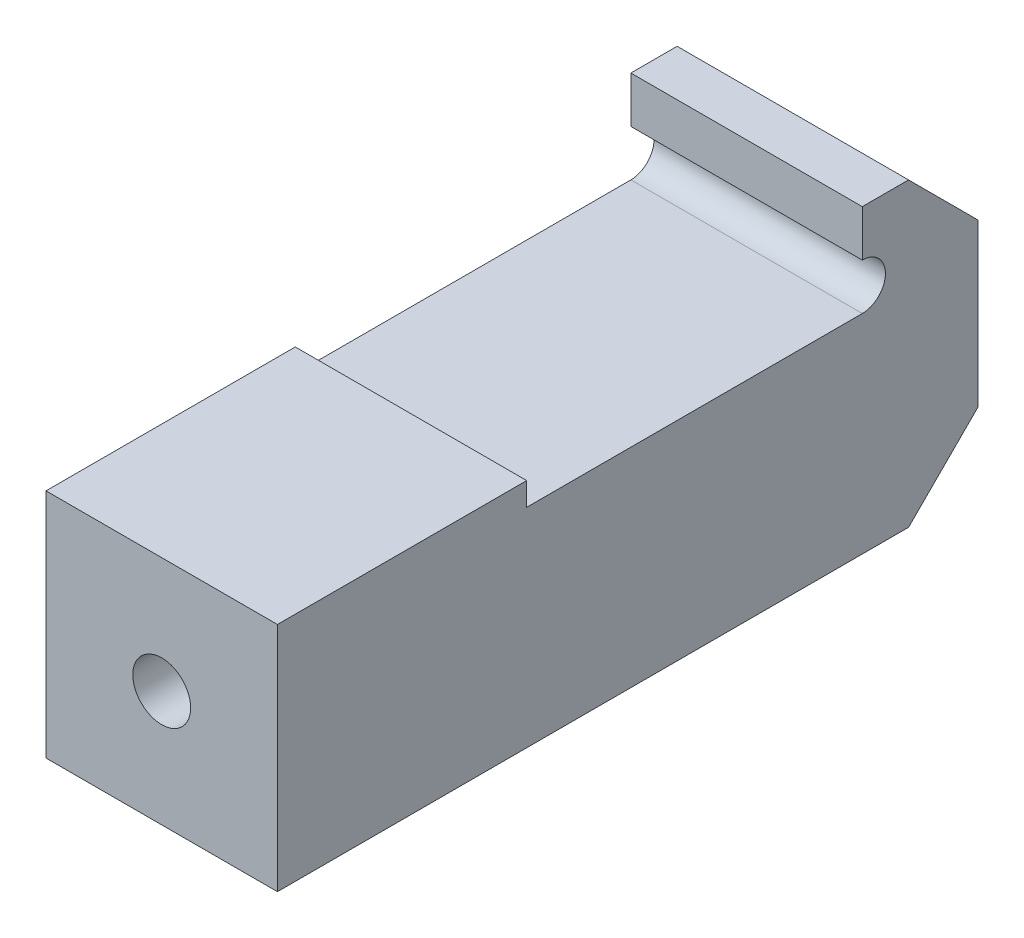
ISO-10303-21;
HEADER;
FILE_DESCRIPTION(('STEP AP214'),'2;1');
FILE_NAME('part.step','',(''),(''),'','','');
FILE_SCHEMA(('AUTOMOTIVE_DESIGN { 1 0 10303 214 1 1 1 1 }'));
ENDSEC;
DATA;
#1=APPLICATION_CONTEXT('core data for automotive mechanical design processes');
#2=APPLICATION_PROTOCOL_DEFINITION('international standard','automotive_design',2000,#1);
#3=PRODUCT_CONTEXT('',#1,'mechanical');
#4=PRODUCT('Part','Part','',(#3));
#5=PRODUCT_RELATED_PRODUCT_CATEGORY('part','',(#4));
#6=PRODUCT_DEFINITION_FORMATION('','',#4);
#7=PRODUCT_DEFINITION_CONTEXT('part definition',#1,'design');
#8=PRODUCT_DEFINITION('design','',#6,#7);
#9=PRODUCT_DEFINITION_SHAPE('','',#8);
#10=(LENGTH_UNIT() NAMED_UNIT(*) SI_UNIT(.MILLI.,.METRE.));
#11=(NAMED_UNIT(*) PLANE_ANGLE_UNIT() SI_UNIT($,.RADIAN.));
#12=(NAMED_UNIT(*) SI_UNIT($,.STERADIAN.) SOLID_ANGLE_UNIT());
#13=UNCERTAINTY_MEASURE_WITH_UNIT(LENGTH_MEASURE(1.E-05),#10,'distance_accuracy_value','');
#14=(GEOMETRIC_REPRESENTATION_CONTEXT(3) GLOBAL_UNCERTAINTY_ASSIGNED_CONTEXT((#13)) GLOBAL_UNIT_ASSIGNED_CONTEXT((#10,
#11,#12)) REPRESENTATION_CONTEXT('',''));
#15=CARTESIAN_POINT('',(0.,0.,0.));
#16=DIRECTION('',(0.,0.,1.));
#17=DIRECTION('',(1.,0.,0.));
#18=AXIS2_PLACEMENT_3D('',#15,#16,#17);
#19=CARTESIAN_POINT('',(-10.,0.,0.));
#20=DIRECTION('',(1.,0.,0.));
#21=DIRECTION('',(0.,0.,-1.));
#22=AXIS2_PLACEMENT_3D('',#19,#20,#21);
#23=CYLINDRICAL_SURFACE('',#22,1.);
#24=CARTESIAN_POINT('',(0.,0.,0.));
#25=DIRECTION('',(-1.,0.,0.));
#26=DIRECTION('',(0.,0.,-1.));
#27=AXIS2_PLACEMENT_3D('',#24,#25,#26);
#28=CIRCLE('',#27,1.);
#29=CARTESIAN_POINT('',(0.,1.,0.));
#30=VERTEX_POINT('',#29);
#31=CARTESIAN_POINT('',(0.,-1.,0.));
#32=VERTEX_POINT('',#31);
#33=EDGE_CURVE('E129',#30,#32,#28,.T.);
#34=ORIENTED_EDGE('',*,*,#33,.F.);
#35=DIRECTION('',(1.,0.,0.));
#36=VECTOR('',#35,1.);
#37=CARTESIAN_POINT('',(-10.,1.,0.));
#38=LINE('',#37,#36);
#39=CARTESIAN_POINT('',(-10.,1.,0.));
#40=VERTEX_POINT('',#39);
#41=EDGE_CURVE('E186',#40,#30,#38,.T.);
#42=ORIENTED_EDGE('',*,*,#41,.F.);
#43=CARTESIAN_POINT('',(-10.,0.,0.));
#44=DIRECTION('',(-1.,0.,0.));
#45=DIRECTION('',(0.,0.,-1.));
#46=AXIS2_PLACEMENT_3D('',#43,#44,#45);
#47=CIRCLE('',#46,1.);
#48=CARTESIAN_POINT('',(-10.,-1.,0.));
#49=VERTEX_POINT('',#48);
#50=EDGE_CURVE('E138',#40,#49,#47,.T.);
#51=ORIENTED_EDGE('',*,*,#50,.T.);
#52=DIRECTION('',(1.,0.,0.));
#53=VECTOR('',#52,1.);
#54=CARTESIAN_POINT('',(-10.,-1.,0.));
#55=LINE('',#54,#53);
#56=EDGE_CURVE('E163',#49,#32,#55,.T.);
#57=ORIENTED_EDGE('',*,*,#56,.T.);
#58=EDGE_LOOP('',(#34,#42,#51,#57));
#59=FACE_BOUND('',#58,.T.);
#60=ADVANCED_FACE('F36',(#59),#23,.F.);
#61=CARTESIAN_POINT('',(-10.,1.,0.));
#62=DIRECTION('',(0.,0.,1.));
#63=DIRECTION('',(0.,-1.,0.));
#64=AXIS2_PLACEMENT_3D('',#61,#62,#63);
#65=PLANE('',#64);
#66=DIRECTION('',(0.,-1.,0.));
#67=VECTOR('',#66,1.);
#68=CARTESIAN_POINT('',(0.,1.,0.));
#69=LINE('',#68,#67);
#70=CARTESIAN_POINT('',(0.,3.,0.));
#71=VERTEX_POINT('',#70);
#72=EDGE_CURVE('E142',#71,#30,#69,.T.);
#73=ORIENTED_EDGE('',*,*,#72,.F.);
#74=DIRECTION('',(1.,0.,0.));
#75=VECTOR('',#74,1.);
#76=CARTESIAN_POINT('',(-10.,3.,0.));
#77=LINE('',#76,#75);
#78=CARTESIAN_POINT('',(-10.,3.,0.));
#79=VERTEX_POINT('',#78);
#80=EDGE_CURVE('E189',#79,#71,#77,.T.);
#81=ORIENTED_EDGE('',*,*,#80,.F.);
#82=DIRECTION('',(0.,-1.,0.));
#83=VECTOR('',#82,1.);
#84=CARTESIAN_POINT('',(-10.,1.,0.));
#85=LINE('',#84,#83);
#86=EDGE_CURVE('E161',#79,#40,#85,.T.);
#87=ORIENTED_EDGE('',*,*,#86,.T.);
#88=ORIENTED_EDGE('',*,*,#41,.T.);
#89=EDGE_LOOP('',(#73,#81,#87,#88));
#90=FACE_BOUND('',#89,.T.);
#91=ADVANCED_FACE('F235',(#90),#65,.T.);
#92=CARTESIAN_POINT('',(-10.,3.,-5.));
#93=DIRECTION('',(0.,1.,0.));
#94=DIRECTION('',(0.,0.,1.));
#95=AXIS2_PLACEMENT_3D('',#92,#93,#94);
#96=PLANE('',#95);
#97=DIRECTION('',(0.,0.,1.));
#98=VECTOR('',#97,1.);
#99=CARTESIAN_POINT('',(0.,3.,-5.));
#100=LINE('',#99,#98);
#101=CARTESIAN_POINT('',(0.,3.,-1.99999999999999));
#102=VERTEX_POINT('',#101);
#103=EDGE_CURVE('E182',#102,#71,#100,.T.);
#104=ORIENTED_EDGE('',*,*,#103,.F.);
#105=DIRECTION('',(-1.,0.,0.));
#106=VECTOR('',#105,1.);
#107=CARTESIAN_POINT('',(-10.,3.,-1.99999999999999));
#108=LINE('',#107,#106);
#109=CARTESIAN_POINT('',(-10.,3.,-1.99999999999999));
#110=VERTEX_POINT('',#109);
#111=EDGE_CURVE('E11',#102,#110,#108,.T.);
#112=ORIENTED_EDGE('',*,*,#111,.T.);
#113=DIRECTION('',(0.,0.,1.));
#114=VECTOR('',#113,1.);
#115=CARTESIAN_POINT('',(-10.,3.,-5.));
#116=LINE('',#115,#114);
#117=EDGE_CURVE('E159',#110,#79,#116,.T.);
#118=ORIENTED_EDGE('',*,*,#117,.T.);
#119=ORIENTED_EDGE('',*,*,#80,.T.);
#120=EDGE_LOOP('',(#104,#112,#118,#119));
#121=FACE_BOUND('',#120,.T.);
#122=ADVANCED_FACE('F230',(#121),#96,.T.);
#123=CARTESIAN_POINT('',(-10.,-10.,-5.));
#124=DIRECTION('',(0.,0.,-1.));
#125=DIRECTION('',(0.,1.,0.));
#126=AXIS2_PLACEMENT_3D('',#123,#124,#125);
#127=PLANE('',#126);
#128=DIRECTION('',(0.,1.,0.));
#129=VECTOR('',#128,1.);
#130=CARTESIAN_POINT('',(0.,-10.,-5.));
#131=LINE('',#130,#129);
#132=CARTESIAN_POINT('',(0.,-6.99999999999999,-5.));
#133=VERTEX_POINT('',#132);
#134=CARTESIAN_POINT('',(0.,0.,-5.));
#135=VERTEX_POINT('',#134);
#136=EDGE_CURVE('E179',#133,#135,#131,.T.);
#137=ORIENTED_EDGE('',*,*,#136,.F.);
#138=DIRECTION('',(-1.,0.,0.));
#139=VECTOR('',#138,1.);
#140=CARTESIAN_POINT('',(-10.,-6.99999999999999,-5.));
#141=LINE('',#140,#139);
#142=CARTESIAN_POINT('',(-10.,-6.99999999999999,-5.));
#143=VERTEX_POINT('',#142);
#144=EDGE_CURVE('E210',#133,#143,#141,.T.);
#145=ORIENTED_EDGE('',*,*,#144,.T.);
#146=DIRECTION('',(0.,1.,0.));
#147=VECTOR('',#146,1.);
#148=CARTESIAN_POINT('',(-10.,-10.,-5.));
#149=LINE('',#148,#147);
#150=CARTESIAN_POINT('',(-10.,0.,-5.));
#151=VERTEX_POINT('',#150);
#152=EDGE_CURVE('E157',#143,#151,#149,.T.);
#153=ORIENTED_EDGE('',*,*,#152,.T.);
#154=DIRECTION('',(1.,0.,0.));
#155=VECTOR('',#154,1.);
#156=CARTESIAN_POINT('',(-10.,0.,-5.));
#157=LINE('',#156,#155);
#158=EDGE_CURVE('E207',#151,#135,#157,.T.);
#159=ORIENTED_EDGE('',*,*,#158,.T.);
#160=EDGE_LOOP('',(#137,#145,#153,#159));
#161=FACE_BOUND('',#160,.T.);
#162=ADVANCED_FACE('F227',(#161),#127,.T.);
#163=CARTESIAN_POINT('',(-10.,-10.,25.27));
#164=DIRECTION('',(0.,-1.,0.));
#165=DIRECTION('',(0.,0.,-1.));
#166=AXIS2_PLACEMENT_3D('',#163,#164,#165);
#167=PLANE('',#166);
#168=DIRECTION('',(0.,0.,-1.));
#169=VECTOR('',#168,1.);
#170=CARTESIAN_POINT('',(-10.,-10.,25.27));
#171=LINE('',#170,#169);
#172=CARTESIAN_POINT('',(-10.,-10.,25.27));
#173=VERTEX_POINT('',#172);
#174=CARTESIAN_POINT('',(-10.,-10.,-2.));
#175=VERTEX_POINT('',#174);
#176=EDGE_CURVE('E154',#173,#175,#171,.T.);
#177=ORIENTED_EDGE('',*,*,#176,.T.);
#178=DIRECTION('',(1.,0.,0.));
#179=VECTOR('',#178,1.);
#180=CARTESIAN_POINT('',(-10.,-10.,-2.));
#181=LINE('',#180,#179);
#182=CARTESIAN_POINT('',(0.,-10.,-2.));
#183=VERTEX_POINT('',#182);
#184=EDGE_CURVE('E188',#175,#183,#181,.T.);
#185=ORIENTED_EDGE('',*,*,#184,.T.);
#186=DIRECTION('',(0.,0.,-1.));
#187=VECTOR('',#186,1.);
#188=CARTESIAN_POINT('',(0.,-10.,25.27));
#189=LINE('',#188,#187);
#190=CARTESIAN_POINT('',(0.,-10.,25.27));
#191=VERTEX_POINT('',#190);
#192=EDGE_CURVE('E176',#191,#183,#189,.T.);
#193=ORIENTED_EDGE('',*,*,#192,.F.);
#194=DIRECTION('',(1.,0.,0.));
#195=VECTOR('',#194,1.);
#196=CARTESIAN_POINT('',(-10.,-10.,25.27));
#197=LINE('',#196,#195);
#198=EDGE_CURVE('E192',#173,#191,#197,.T.);
#199=ORIENTED_EDGE('',*,*,#198,.F.);
#200=EDGE_LOOP('',(#177,#185,#193,#199));
#201=FACE_BOUND('',#200,.T.);
#202=ADVANCED_FACE('F220',(#201),#167,.T.);
#203=CARTESIAN_POINT('',(-10.,0.,25.27));
#204=DIRECTION('',(0.,0.,1.));
#205=DIRECTION('',(1.,0.,0.));
#206=AXIS2_PLACEMENT_3D('',#203,#204,#205);
#207=PLANE('',#206);
#208=CARTESIAN_POINT('',(-5.,-5.,25.27));
#209=DIRECTION('',(0.,0.,1.));
#210=DIRECTION('',(1.,0.,0.));
#211=AXIS2_PLACEMENT_3D('',#208,#209,#210);
#212=CIRCLE('',#211,1.24999999999999);
#213=CARTESIAN_POINT('',(-3.75000000000001,-5.,25.27));
#214=VERTEX_POINT('',#213);
#215=EDGE_CURVE('E130',#214,#214,#212,.T.);
#216=ORIENTED_EDGE('',*,*,#215,.F.);
#217=EDGE_LOOP('',(#216));
#218=FACE_BOUND('',#217,.T.);
#219=DIRECTION('',(0.,-1.,0.));
#220=VECTOR('',#219,1.);
#221=CARTESIAN_POINT('',(0.,0.,25.27));
#222=LINE('',#221,#220);
#223=CARTESIAN_POINT('',(0.,0.,25.27));
#224=VERTEX_POINT('',#223);
#225=EDGE_CURVE('E173',#224,#191,#222,.T.);
#226=ORIENTED_EDGE('',*,*,#225,.F.);
#227=DIRECTION('',(1.,0.,0.));
#228=VECTOR('',#227,1.);
#229=CARTESIAN_POINT('',(-10.,0.,25.27));
#230=LINE('',#229,#228);
#231=CARTESIAN_POINT('',(-10.,0.,25.27));
#232=VERTEX_POINT('',#231);
#233=EDGE_CURVE('E194',#232,#224,#230,.T.);
#234=ORIENTED_EDGE('',*,*,#233,.F.);
#235=DIRECTION('',(0.,-1.,0.));
#236=VECTOR('',#235,1.);
#237=CARTESIAN_POINT('',(-10.,0.,25.27));
#238=LINE('',#237,#236);
#239=EDGE_CURVE('E151',#232,#173,#238,.T.);
#240=ORIENTED_EDGE('',*,*,#239,.T.);
#241=ORIENTED_EDGE('',*,*,#198,.T.);
#242=EDGE_LOOP('',(#226,#234,#240,#241));
#243=FACE_BOUND('',#242,.T.);
#244=ADVANCED_FACE('F253',(#218,#243),#207,.T.);
#245=CARTESIAN_POINT('',(-10.,0.,14.5));
#246=DIRECTION('',(0.,1.,0.));
#247=DIRECTION('',(0.,0.,1.));
#248=AXIS2_PLACEMENT_3D('',#245,#246,#247);
#249=PLANE('',#248);
#250=DIRECTION('',(0.,0.,1.));
#251=VECTOR('',#250,1.);
#252=CARTESIAN_POINT('',(0.,0.,14.5));
#253=LINE('',#252,#251);
#254=CARTESIAN_POINT('',(0.,0.,14.5));
#255=VERTEX_POINT('',#254);
#256=EDGE_CURVE('E170',#255,#224,#253,.T.);
#257=ORIENTED_EDGE('',*,*,#256,.F.);
#258=DIRECTION('',(1.,0.,0.));
#259=VECTOR('',#258,1.);
#260=CARTESIAN_POINT('',(-10.,0.,14.5));
#261=LINE('',#260,#259);
#262=CARTESIAN_POINT('',(-10.,0.,14.5));
#263=VERTEX_POINT('',#262);
#264=EDGE_CURVE('E196',#263,#255,#261,.T.);
#265=ORIENTED_EDGE('',*,*,#264,.F.);
#266=DIRECTION('',(0.,0.,1.));
#267=VECTOR('',#266,1.);
#268=CARTESIAN_POINT('',(-10.,0.,14.5));
#269=LINE('',#268,#267);
#270=EDGE_CURVE('E148',#263,#232,#269,.T.);
#271=ORIENTED_EDGE('',*,*,#270,.T.);
#272=ORIENTED_EDGE('',*,*,#233,.T.);
#273=EDGE_LOOP('',(#257,#265,#271,#272));
#274=FACE_BOUND('',#273,.T.);
#275=ADVANCED_FACE('F250',(#274),#249,.T.);
#276=CARTESIAN_POINT('',(-10.,-1.,14.5));
#277=DIRECTION('',(0.,0.,-1.));
#278=DIRECTION('',(-1.,0.,0.));
#279=AXIS2_PLACEMENT_3D('',#276,#277,#278);
#280=PLANE('',#279);
#281=DIRECTION('',(0.,1.,0.));
#282=VECTOR('',#281,1.);
#283=CARTESIAN_POINT('',(0.,-1.,14.5));
#284=LINE('',#283,#282);
#285=CARTESIAN_POINT('',(0.,-1.,14.5));
#286=VERTEX_POINT('',#285);
#287=EDGE_CURVE('E167',#286,#255,#284,.T.);
#288=ORIENTED_EDGE('',*,*,#287,.F.);
#289=DIRECTION('',(1.,0.,0.));
#290=VECTOR('',#289,1.);
#291=CARTESIAN_POINT('',(-10.,-1.,14.5));
#292=LINE('',#291,#290);
#293=CARTESIAN_POINT('',(-10.,-1.,14.5));
#294=VERTEX_POINT('',#293);
#295=EDGE_CURVE('E198',#294,#286,#292,.T.);
#296=ORIENTED_EDGE('',*,*,#295,.F.);
#297=DIRECTION('',(0.,1.,0.));
#298=VECTOR('',#297,1.);
#299=CARTESIAN_POINT('',(-10.,-1.,14.5));
#300=LINE('',#299,#298);
#301=EDGE_CURVE('E145',#294,#263,#300,.T.);
#302=ORIENTED_EDGE('',*,*,#301,.T.);
#303=ORIENTED_EDGE('',*,*,#264,.T.);
#304=EDGE_LOOP('',(#288,#296,#302,#303));
#305=FACE_BOUND('',#304,.T.);
#306=ADVANCED_FACE('F246',(#305),#280,.T.);
#307=CARTESIAN_POINT('',(-10.,-1.,0.));
#308=DIRECTION('',(0.,1.,0.));
#309=DIRECTION('',(0.,0.,1.));
#310=AXIS2_PLACEMENT_3D('',#307,#308,#309);
#311=PLANE('',#310);
#312=DIRECTION('',(0.,0.,1.));
#313=VECTOR('',#312,1.);
#314=CARTESIAN_POINT('',(0.,-1.,0.));
#315=LINE('',#314,#313);
#316=EDGE_CURVE('E133',#32,#286,#315,.T.);
#317=ORIENTED_EDGE('',*,*,#316,.F.);
#318=ORIENTED_EDGE('',*,*,#56,.F.);
#319=DIRECTION('',(0.,0.,1.));
#320=VECTOR('',#319,1.);
#321=CARTESIAN_POINT('',(-10.,-1.,0.));
#322=LINE('',#321,#320);
#323=EDGE_CURVE('E141',#49,#294,#322,.T.);
#324=ORIENTED_EDGE('',*,*,#323,.T.);
#325=ORIENTED_EDGE('',*,*,#295,.T.);
#326=EDGE_LOOP('',(#317,#318,#324,#325));
#327=FACE_BOUND('',#326,.T.);
#328=ADVANCED_FACE('F242',(#327),#311,.T.);
#329=CARTESIAN_POINT('',(-10.,0.,0.));
#330=DIRECTION('',(1.,0.,0.));
#331=DIRECTION('',(0.,0.,-1.));
#332=AXIS2_PLACEMENT_3D('',#329,#330,#331);
#333=PLANE('',#332);
#334=ORIENTED_EDGE('',*,*,#152,.F.);
#335=DIRECTION('',(0.,0.707106781186549,-0.707106781186546));
#336=VECTOR('',#335,1.);
#337=CARTESIAN_POINT('',(-10.,-10.,-2.));
#338=LINE('',#337,#336);
#339=EDGE_CURVE('E44',#143,#175,#338,.F.);
#340=ORIENTED_EDGE('',*,*,#339,.T.);
#341=ORIENTED_EDGE('',*,*,#176,.F.);
#342=ORIENTED_EDGE('',*,*,#239,.F.);
#343=ORIENTED_EDGE('',*,*,#270,.F.);
#344=ORIENTED_EDGE('',*,*,#301,.F.);
#345=ORIENTED_EDGE('',*,*,#323,.F.);
#346=ORIENTED_EDGE('',*,*,#50,.F.);
#347=ORIENTED_EDGE('',*,*,#86,.F.);
#348=ORIENTED_EDGE('',*,*,#117,.F.);
#349=DIRECTION('',(0.,0.707106781186547,0.707106781186548));
#350=VECTOR('',#349,1.);
#351=CARTESIAN_POINT('',(-10.,0.,-5.));
#352=LINE('',#351,#350);
#353=EDGE_CURVE('E56',#110,#151,#352,.F.);
#354=ORIENTED_EDGE('',*,*,#353,.T.);
#355=EDGE_LOOP('',(#334,#340,#341,#342,#343,#344,#345,#346,#347,#348,#354));
#356=FACE_BOUND('',#355,.T.);
#357=ADVANCED_FACE('F214',(#356),#333,.F.);
#358=CARTESIAN_POINT('',(0.,0.,0.));
#359=DIRECTION('',(1.,0.,0.));
#360=DIRECTION('',(0.,0.,-1.));
#361=AXIS2_PLACEMENT_3D('',#358,#359,#360);
#362=PLANE('',#361);
#363=ORIENTED_EDGE('',*,*,#192,.T.);
#364=DIRECTION('',(0.,-0.707106781186549,0.707106781186546));
#365=VECTOR('',#364,1.);
#366=CARTESIAN_POINT('',(0.,-5.99999999999998,-6.));
#367=LINE('',#366,#365);
#368=EDGE_CURVE('E205',#183,#133,#367,.F.);
#369=ORIENTED_EDGE('',*,*,#368,.T.);
#370=ORIENTED_EDGE('',*,*,#136,.T.);
#371=DIRECTION('',(0.,-0.707106781186547,-0.707106781186548));
#372=VECTOR('',#371,1.);
#373=CARTESIAN_POINT('',(0.,2.5,-2.49999999999999));
#374=LINE('',#373,#372);
#375=EDGE_CURVE('E203',#135,#102,#374,.F.);
#376=ORIENTED_EDGE('',*,*,#375,.T.);
#377=ORIENTED_EDGE('',*,*,#103,.T.);
#378=ORIENTED_EDGE('',*,*,#72,.T.);
#379=ORIENTED_EDGE('',*,*,#33,.T.);
#380=ORIENTED_EDGE('',*,*,#316,.T.);
#381=ORIENTED_EDGE('',*,*,#287,.T.);
#382=ORIENTED_EDGE('',*,*,#256,.T.);
#383=ORIENTED_EDGE('',*,*,#225,.T.);
#384=EDGE_LOOP('',(#363,#369,#370,#376,#377,#378,#379,#380,#381,#382,#383));
#385=FACE_BOUND('',#384,.T.);
#386=ADVANCED_FACE('F225',(#385),#362,.T.);
#387=CARTESIAN_POINT('',(-10.,-10.,-2.));
#388=DIRECTION('',(0.,0.707106781186546,0.707106781186549));
#389=DIRECTION('',(1.,0.,0.));
#390=AXIS2_PLACEMENT_3D('',#387,#388,#389);
#391=PLANE('',#390);
#392=ORIENTED_EDGE('',*,*,#339,.F.);
#393=ORIENTED_EDGE('',*,*,#144,.F.);
#394=ORIENTED_EDGE('',*,*,#368,.F.);
#395=ORIENTED_EDGE('',*,*,#184,.F.);
#396=EDGE_LOOP('',(#392,#393,#394,#395));
#397=FACE_BOUND('',#396,.T.);
#398=ADVANCED_FACE('F222',(#397),#391,.F.);
#399=CARTESIAN_POINT('',(-10.,0.,-5.));
#400=DIRECTION('',(0.,-0.707106781186548,0.707106781186547));
#401=DIRECTION('',(1.,0.,0.));
#402=AXIS2_PLACEMENT_3D('',#399,#400,#401);
#403=PLANE('',#402);
#404=ORIENTED_EDGE('',*,*,#353,.F.);
#405=ORIENTED_EDGE('',*,*,#111,.F.);
#406=ORIENTED_EDGE('',*,*,#375,.F.);
#407=ORIENTED_EDGE('',*,*,#158,.F.);
#408=EDGE_LOOP('',(#404,#405,#406,#407));
#409=FACE_BOUND('',#408,.T.);
#410=ADVANCED_FACE('F38',(#409),#403,.F.);
#411=CARTESIAN_POINT('',(-5.,-5.,10.77));
#412=DIRECTION('',(0.,0.,1.));
#413=DIRECTION('',(1.,0.,0.));
#414=AXIS2_PLACEMENT_3D('',#411,#412,#413);
#415=CONICAL_SURFACE('',#414,1.25,1.02974425867665);
#416=CARTESIAN_POINT('',(-5.,-5.,10.0189242262155));
#417=VERTEX_POINT('',#416);
#418=VERTEX_LOOP('',#417);
#419=FACE_BOUND('',#418,.T.);
#420=CARTESIAN_POINT('',(-5.,-5.,10.77));
#421=DIRECTION('',(0.,0.,1.));
#422=DIRECTION('',(1.,0.,0.));
#423=AXIS2_PLACEMENT_3D('',#420,#421,#422);
#424=CIRCLE('',#423,1.25);
#425=CARTESIAN_POINT('',(-3.75,-5.,10.77));
#426=VERTEX_POINT('',#425);
#427=EDGE_CURVE('E127',#426,#426,#424,.T.);
#428=ORIENTED_EDGE('',*,*,#427,.T.);
#429=EDGE_LOOP('',(#428));
#430=FACE_BOUND('',#429,.T.);
#431=ADVANCED_FACE('F120',(#419,#430),#415,.F.);
#432=CARTESIAN_POINT('',(-5.,-5.,25.27));
#433=DIRECTION('',(0.,0.,1.));
#434=DIRECTION('',(1.,0.,0.));
#435=AXIS2_PLACEMENT_3D('',#432,#433,#434);
#436=CYLINDRICAL_SURFACE('',#435,1.24999999999999);
#437=ORIENTED_EDGE('',*,*,#427,.F.);
#438=EDGE_LOOP('',(#437));
#439=FACE_BOUND('',#438,.T.);
#440=ORIENTED_EDGE('',*,*,#215,.T.);
#441=EDGE_LOOP('',(#440));
#442=FACE_BOUND('',#441,.T.);
#443=ADVANCED_FACE('F123',(#439,#442),#436,.F.);
#444=CLOSED_SHELL('',(#60,#91,#122,#162,#202,#244,#275,#306,#328,#357,#386,#398,#410,#431,#443));
#445=MANIFOLD_SOLID_BREP('B2',#444);
#446=ADVANCED_BREP_SHAPE_REPRESENTATION('',(#18,#445),#14);
#447=SHAPE_DEFINITION_REPRESENTATION(#9,#446);
ENDSEC;
END-ISO-10303-21;
